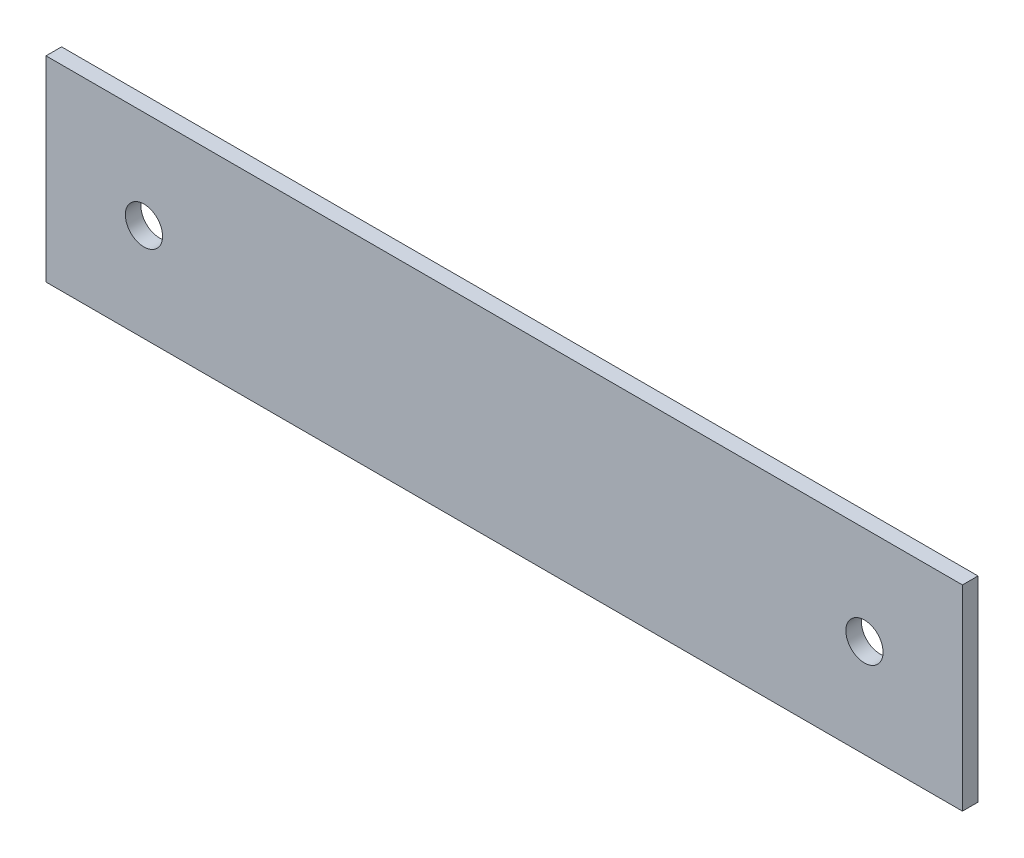
ISO-10303-21;
HEADER;
FILE_DESCRIPTION(('STEP AP214'),'2;1');
FILE_NAME('part.step','',(''),(''),'','','');
FILE_SCHEMA(('AUTOMOTIVE_DESIGN { 1 0 10303 214 1 1 1 1 }'));
ENDSEC;
DATA;
#1=APPLICATION_CONTEXT('core data for automotive mechanical design processes');
#2=APPLICATION_PROTOCOL_DEFINITION('international standard','automotive_design',2000,#1);
#3=PRODUCT_CONTEXT('',#1,'mechanical');
#4=PRODUCT('Part','Part','',(#3));
#5=PRODUCT_RELATED_PRODUCT_CATEGORY('part','',(#4));
#6=PRODUCT_DEFINITION_FORMATION('','',#4);
#7=PRODUCT_DEFINITION_CONTEXT('part definition',#1,'design');
#8=PRODUCT_DEFINITION('design','',#6,#7);
#9=PRODUCT_DEFINITION_SHAPE('','',#8);
#10=(LENGTH_UNIT() NAMED_UNIT(*) SI_UNIT(.MILLI.,.METRE.));
#11=(NAMED_UNIT(*) PLANE_ANGLE_UNIT() SI_UNIT($,.RADIAN.));
#12=(NAMED_UNIT(*) SI_UNIT($,.STERADIAN.) SOLID_ANGLE_UNIT());
#13=UNCERTAINTY_MEASURE_WITH_UNIT(LENGTH_MEASURE(1.E-05),#10,'distance_accuracy_value','');
#14=(GEOMETRIC_REPRESENTATION_CONTEXT(3) GLOBAL_UNCERTAINTY_ASSIGNED_CONTEXT((#13)) GLOBAL_UNIT_ASSIGNED_CONTEXT((#10,
#11,#12)) REPRESENTATION_CONTEXT('',''));
#15=CARTESIAN_POINT('',(0.,0.,0.));
#16=DIRECTION('',(0.,0.,1.));
#17=DIRECTION('',(1.,0.,0.));
#18=AXIS2_PLACEMENT_3D('',#15,#16,#17);
#19=CARTESIAN_POINT('',(46.77,10.,1.5875));
#20=DIRECTION('',(-1.,0.,0.));
#21=DIRECTION('',(0.,0.,1.));
#22=AXIS2_PLACEMENT_3D('',#19,#20,#21);
#23=PLANE('',#22);
#24=DIRECTION('',(0.,1.,0.));
#25=VECTOR('',#24,1.);
#26=CARTESIAN_POINT('',(46.77,10.,0.));
#27=LINE('',#26,#25);
#28=CARTESIAN_POINT('',(46.77,-10.,0.));
#29=VERTEX_POINT('',#28);
#30=CARTESIAN_POINT('',(46.77,10.,0.));
#31=VERTEX_POINT('',#30);
#32=EDGE_CURVE('E98',#29,#31,#27,.T.);
#33=ORIENTED_EDGE('',*,*,#32,.T.);
#34=DIRECTION('',(0.,0.,-1.));
#35=VECTOR('',#34,1.);
#36=CARTESIAN_POINT('',(46.77,10.,1.5875));
#37=LINE('',#36,#35);
#38=CARTESIAN_POINT('',(46.77,10.,1.5875));
#39=VERTEX_POINT('',#38);
#40=EDGE_CURVE('E11',#39,#31,#37,.T.);
#41=ORIENTED_EDGE('',*,*,#40,.F.);
#42=DIRECTION('',(0.,1.,0.));
#43=VECTOR('',#42,1.);
#44=CARTESIAN_POINT('',(46.77,10.,1.5875));
#45=LINE('',#44,#43);
#46=CARTESIAN_POINT('',(46.77,-10.,1.5875));
#47=VERTEX_POINT('',#46);
#48=EDGE_CURVE('E86',#47,#39,#45,.T.);
#49=ORIENTED_EDGE('',*,*,#48,.F.);
#50=DIRECTION('',(0.,0.,-1.));
#51=VECTOR('',#50,1.);
#52=CARTESIAN_POINT('',(46.77,-10.,1.5875));
#53=LINE('',#52,#51);
#54=EDGE_CURVE('E94',#47,#29,#53,.T.);
#55=ORIENTED_EDGE('',*,*,#54,.T.);
#56=EDGE_LOOP('',(#33,#41,#49,#55));
#57=FACE_BOUND('',#56,.T.);
#58=ADVANCED_FACE('F35',(#57),#23,.F.);
#59=CARTESIAN_POINT('',(-46.77,10.,1.5875));
#60=DIRECTION('',(0.,-1.,0.));
#61=DIRECTION('',(0.,0.,-1.));
#62=AXIS2_PLACEMENT_3D('',#59,#60,#61);
#63=PLANE('',#62);
#64=DIRECTION('',(-1.,0.,0.));
#65=VECTOR('',#64,1.);
#66=CARTESIAN_POINT('',(-46.77,10.,0.));
#67=LINE('',#66,#65);
#68=CARTESIAN_POINT('',(-46.77,10.,0.));
#69=VERTEX_POINT('',#68);
#70=EDGE_CURVE('E90',#31,#69,#67,.T.);
#71=ORIENTED_EDGE('',*,*,#70,.T.);
#72=DIRECTION('',(0.,0.,-1.));
#73=VECTOR('',#72,1.);
#74=CARTESIAN_POINT('',(-46.77,10.,1.5875));
#75=LINE('',#74,#73);
#76=CARTESIAN_POINT('',(-46.77,10.,1.5875));
#77=VERTEX_POINT('',#76);
#78=EDGE_CURVE('E43',#77,#69,#75,.T.);
#79=ORIENTED_EDGE('',*,*,#78,.F.);
#80=DIRECTION('',(-1.,0.,0.));
#81=VECTOR('',#80,1.);
#82=CARTESIAN_POINT('',(-46.77,10.,1.5875));
#83=LINE('',#82,#81);
#84=EDGE_CURVE('E81',#39,#77,#83,.T.);
#85=ORIENTED_EDGE('',*,*,#84,.F.);
#86=ORIENTED_EDGE('',*,*,#40,.T.);
#87=EDGE_LOOP('',(#71,#79,#85,#86));
#88=FACE_BOUND('',#87,.T.);
#89=ADVANCED_FACE('F89',(#88),#63,.F.);
#90=CARTESIAN_POINT('',(-46.77,10.,1.5875));
#91=DIRECTION('',(1.,0.,0.));
#92=DIRECTION('',(0.,0.,-1.));
#93=AXIS2_PLACEMENT_3D('',#90,#91,#92);
#94=PLANE('',#93);
#95=DIRECTION('',(0.,-1.,0.));
#96=VECTOR('',#95,1.);
#97=CARTESIAN_POINT('',(-46.77,10.,0.));
#98=LINE('',#97,#96);
#99=CARTESIAN_POINT('',(-46.77,-10.,0.));
#100=VERTEX_POINT('',#99);
#101=EDGE_CURVE('E68',#69,#100,#98,.T.);
#102=ORIENTED_EDGE('',*,*,#101,.T.);
#103=DIRECTION('',(0.,0.,-1.));
#104=VECTOR('',#103,1.);
#105=CARTESIAN_POINT('',(-46.77,-10.,1.5875));
#106=LINE('',#105,#104);
#107=CARTESIAN_POINT('',(-46.77,-10.,1.5875));
#108=VERTEX_POINT('',#107);
#109=EDGE_CURVE('E91',#108,#100,#106,.T.);
#110=ORIENTED_EDGE('',*,*,#109,.F.);
#111=DIRECTION('',(0.,-1.,0.));
#112=VECTOR('',#111,1.);
#113=CARTESIAN_POINT('',(-46.77,10.,1.5875));
#114=LINE('',#113,#112);
#115=EDGE_CURVE('E84',#77,#108,#114,.T.);
#116=ORIENTED_EDGE('',*,*,#115,.F.);
#117=ORIENTED_EDGE('',*,*,#78,.T.);
#118=EDGE_LOOP('',(#102,#110,#116,#117));
#119=FACE_BOUND('',#118,.T.);
#120=ADVANCED_FACE('F92',(#119),#94,.F.);
#121=CARTESIAN_POINT('',(-46.77,-10.,1.5875));
#122=DIRECTION('',(0.,1.,0.));
#123=DIRECTION('',(0.,0.,1.));
#124=AXIS2_PLACEMENT_3D('',#121,#122,#123);
#125=PLANE('',#124);
#126=DIRECTION('',(1.,0.,0.));
#127=VECTOR('',#126,1.);
#128=CARTESIAN_POINT('',(-46.77,-10.,0.));
#129=LINE('',#128,#127);
#130=EDGE_CURVE('E74',#100,#29,#129,.T.);
#131=ORIENTED_EDGE('',*,*,#130,.T.);
#132=ORIENTED_EDGE('',*,*,#54,.F.);
#133=DIRECTION('',(1.,0.,0.));
#134=VECTOR('',#133,1.);
#135=CARTESIAN_POINT('',(-46.77,-10.,1.5875));
#136=LINE('',#135,#134);
#137=EDGE_CURVE('E51',#108,#47,#136,.T.);
#138=ORIENTED_EDGE('',*,*,#137,.F.);
#139=ORIENTED_EDGE('',*,*,#109,.T.);
#140=EDGE_LOOP('',(#131,#132,#138,#139));
#141=FACE_BOUND('',#140,.T.);
#142=ADVANCED_FACE('F106',(#141),#125,.F.);
#143=CARTESIAN_POINT('',(0.,0.,1.5875));
#144=DIRECTION('',(0.,0.,1.));
#145=DIRECTION('',(1.,0.,0.));
#146=AXIS2_PLACEMENT_3D('',#143,#144,#145);
#147=PLANE('',#146);
#148=CARTESIAN_POINT('',(-36.77,0.,1.5875));
#149=DIRECTION('',(0.,0.,1.));
#150=DIRECTION('',(1.,0.,0.));
#151=AXIS2_PLACEMENT_3D('',#148,#149,#150);
#152=CIRCLE('',#151,1.89864999999999);
#153=CARTESIAN_POINT('',(-34.87135,0.,1.5875));
#154=VERTEX_POINT('',#153);
#155=EDGE_CURVE('E120',#154,#154,#152,.T.);
#156=ORIENTED_EDGE('',*,*,#155,.F.);
#157=EDGE_LOOP('',(#156));
#158=FACE_BOUND('',#157,.T.);
#159=CARTESIAN_POINT('',(36.77,0.,1.5875));
#160=DIRECTION('',(0.,0.,1.));
#161=DIRECTION('',(1.,0.,0.));
#162=AXIS2_PLACEMENT_3D('',#159,#160,#161);
#163=CIRCLE('',#162,1.89864999999999);
#164=CARTESIAN_POINT('',(38.66865,0.,1.5875));
#165=VERTEX_POINT('',#164);
#166=EDGE_CURVE('E114',#165,#165,#163,.T.);
#167=ORIENTED_EDGE('',*,*,#166,.F.);
#168=EDGE_LOOP('',(#167));
#169=FACE_BOUND('',#168,.T.);
#170=ORIENTED_EDGE('',*,*,#48,.T.);
#171=ORIENTED_EDGE('',*,*,#84,.T.);
#172=ORIENTED_EDGE('',*,*,#115,.T.);
#173=ORIENTED_EDGE('',*,*,#137,.T.);
#174=EDGE_LOOP('',(#170,#171,#172,#173));
#175=FACE_BOUND('',#174,.T.);
#176=ADVANCED_FACE('F82',(#158,#169,#175),#147,.T.);
#177=CARTESIAN_POINT('',(0.,0.,0.));
#178=DIRECTION('',(0.,0.,1.));
#179=DIRECTION('',(1.,0.,0.));
#180=AXIS2_PLACEMENT_3D('',#177,#178,#179);
#181=PLANE('',#180);
#182=CARTESIAN_POINT('',(-36.77,0.,0.));
#183=DIRECTION('',(0.,0.,1.));
#184=DIRECTION('',(1.,0.,0.));
#185=AXIS2_PLACEMENT_3D('',#182,#183,#184);
#186=CIRCLE('',#185,1.89864999999999);
#187=CARTESIAN_POINT('',(-34.87135,0.,0.));
#188=VERTEX_POINT('',#187);
#189=EDGE_CURVE('E117',#188,#188,#186,.T.);
#190=ORIENTED_EDGE('',*,*,#189,.T.);
#191=EDGE_LOOP('',(#190));
#192=FACE_BOUND('',#191,.T.);
#193=CARTESIAN_POINT('',(36.77,0.,0.));
#194=DIRECTION('',(0.,0.,1.));
#195=DIRECTION('',(1.,0.,0.));
#196=AXIS2_PLACEMENT_3D('',#193,#194,#195);
#197=CIRCLE('',#196,1.89864999999999);
#198=CARTESIAN_POINT('',(38.66865,0.,0.));
#199=VERTEX_POINT('',#198);
#200=EDGE_CURVE('E101',#199,#199,#197,.T.);
#201=ORIENTED_EDGE('',*,*,#200,.T.);
#202=EDGE_LOOP('',(#201));
#203=FACE_BOUND('',#202,.T.);
#204=ORIENTED_EDGE('',*,*,#32,.F.);
#205=ORIENTED_EDGE('',*,*,#130,.F.);
#206=ORIENTED_EDGE('',*,*,#101,.F.);
#207=ORIENTED_EDGE('',*,*,#70,.F.);
#208=EDGE_LOOP('',(#204,#205,#206,#207));
#209=FACE_BOUND('',#208,.T.);
#210=ADVANCED_FACE('F109',(#192,#203,#209),#181,.F.);
#211=CARTESIAN_POINT('',(36.77,0.,1.5875));
#212=DIRECTION('',(0.,0.,1.));
#213=DIRECTION('',(1.,0.,0.));
#214=AXIS2_PLACEMENT_3D('',#211,#212,#213);
#215=CYLINDRICAL_SURFACE('',#214,1.89864999999999);
#216=ORIENTED_EDGE('',*,*,#200,.F.);
#217=EDGE_LOOP('',(#216));
#218=FACE_BOUND('',#217,.T.);
#219=ORIENTED_EDGE('',*,*,#166,.T.);
#220=EDGE_LOOP('',(#219));
#221=FACE_BOUND('',#220,.T.);
#222=ADVANCED_FACE('F131',(#218,#221),#215,.F.);
#223=CARTESIAN_POINT('',(-36.77,0.,1.5875));
#224=DIRECTION('',(0.,0.,1.));
#225=DIRECTION('',(1.,0.,0.));
#226=AXIS2_PLACEMENT_3D('',#223,#224,#225);
#227=CYLINDRICAL_SURFACE('',#226,1.89864999999999);
#228=ORIENTED_EDGE('',*,*,#189,.F.);
#229=EDGE_LOOP('',(#228));
#230=FACE_BOUND('',#229,.T.);
#231=ORIENTED_EDGE('',*,*,#155,.T.);
#232=EDGE_LOOP('',(#231));
#233=FACE_BOUND('',#232,.T.);
#234=ADVANCED_FACE('F124',(#230,#233),#227,.F.);
#235=CLOSED_SHELL('',(#58,#89,#120,#142,#176,#210,#222,#234));
#236=MANIFOLD_SOLID_BREP('B2',#235);
#237=ADVANCED_BREP_SHAPE_REPRESENTATION('',(#18,#236),#14);
#238=SHAPE_DEFINITION_REPRESENTATION(#9,#237);
ENDSEC;
END-ISO-10303-21;
